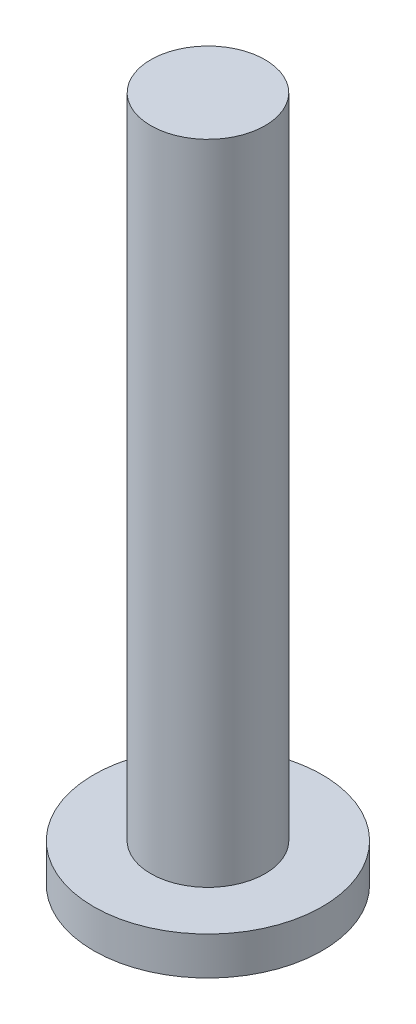
ISO-10303-21;
HEADER;
FILE_DESCRIPTION(('STEP AP214'),'2;1');
FILE_NAME('part.step','',(''),(''),'','','');
FILE_SCHEMA(('AUTOMOTIVE_DESIGN { 1 0 10303 214 1 1 1 1 }'));
ENDSEC;
DATA;
#1=APPLICATION_CONTEXT('core data for automotive mechanical design processes');
#2=APPLICATION_PROTOCOL_DEFINITION('international standard','automotive_design',2000,#1);
#3=PRODUCT_CONTEXT('',#1,'mechanical');
#4=PRODUCT('Part','Part','',(#3));
#5=PRODUCT_RELATED_PRODUCT_CATEGORY('part','',(#4));
#6=PRODUCT_DEFINITION_FORMATION('','',#4);
#7=PRODUCT_DEFINITION_CONTEXT('part definition',#1,'design');
#8=PRODUCT_DEFINITION('design','',#6,#7);
#9=PRODUCT_DEFINITION_SHAPE('','',#8);
#10=(LENGTH_UNIT() NAMED_UNIT(*) SI_UNIT(.MILLI.,.METRE.));
#11=(NAMED_UNIT(*) PLANE_ANGLE_UNIT() SI_UNIT($,.RADIAN.));
#12=(NAMED_UNIT(*) SI_UNIT($,.STERADIAN.) SOLID_ANGLE_UNIT());
#13=UNCERTAINTY_MEASURE_WITH_UNIT(LENGTH_MEASURE(1.E-05),#10,'distance_accuracy_value','');
#14=(GEOMETRIC_REPRESENTATION_CONTEXT(3) GLOBAL_UNCERTAINTY_ASSIGNED_CONTEXT((#13)) GLOBAL_UNIT_ASSIGNED_CONTEXT((#10,
#11,#12)) REPRESENTATION_CONTEXT('',''));
#15=CARTESIAN_POINT('',(0.,0.,0.));
#16=DIRECTION('',(0.,0.,1.));
#17=DIRECTION('',(1.,0.,0.));
#18=AXIS2_PLACEMENT_3D('',#15,#16,#17);
#19=CARTESIAN_POINT('',(0.,10.,0.));
#20=DIRECTION('',(0.,-1.,0.));
#21=DIRECTION('',(0.,0.,-1.));
#22=AXIS2_PLACEMENT_3D('',#19,#20,#21);
#23=CYLINDRICAL_SURFACE('',#22,30.);
#24=CARTESIAN_POINT('',(0.,10.,0.));
#25=DIRECTION('',(0.,1.,0.));
#26=DIRECTION('',(0.,0.,1.));
#27=AXIS2_PLACEMENT_3D('',#24,#25,#26);
#28=CIRCLE('',#27,30.);
#29=CARTESIAN_POINT('',(0.,10.,30.));
#30=VERTEX_POINT('',#29);
#31=EDGE_CURVE('E10',#30,#30,#28,.T.);
#32=ORIENTED_EDGE('',*,*,#31,.F.);
#33=EDGE_LOOP('',(#32));
#34=FACE_BOUND('',#33,.T.);
#35=CARTESIAN_POINT('',(0.,0.,0.));
#36=DIRECTION('',(0.,1.,0.));
#37=DIRECTION('',(0.,0.,1.));
#38=AXIS2_PLACEMENT_3D('',#35,#36,#37);
#39=CIRCLE('',#38,30.);
#40=CARTESIAN_POINT('',(0.,0.,30.));
#41=VERTEX_POINT('',#40);
#42=EDGE_CURVE('E34',#41,#41,#39,.T.);
#43=ORIENTED_EDGE('',*,*,#42,.T.);
#44=EDGE_LOOP('',(#43));
#45=FACE_BOUND('',#44,.T.);
#46=ADVANCED_FACE('F31',(#34,#45),#23,.T.);
#47=CARTESIAN_POINT('',(0.,10.,0.));
#48=DIRECTION('',(0.,1.,0.));
#49=DIRECTION('',(0.,0.,1.));
#50=AXIS2_PLACEMENT_3D('',#47,#48,#49);
#51=PLANE('',#50);
#52=CARTESIAN_POINT('',(0.,10.,0.));
#53=DIRECTION('',(0.,1.,0.));
#54=DIRECTION('',(0.,0.,1.));
#55=AXIS2_PLACEMENT_3D('',#52,#53,#54);
#56=CIRCLE('',#55,15.);
#57=CARTESIAN_POINT('',(0.,10.,15.));
#58=VERTEX_POINT('',#57);
#59=EDGE_CURVE('E43',#58,#58,#56,.T.);
#60=ORIENTED_EDGE('',*,*,#59,.F.);
#61=EDGE_LOOP('',(#60));
#62=FACE_BOUND('',#61,.T.);
#63=ORIENTED_EDGE('',*,*,#31,.T.);
#64=EDGE_LOOP('',(#63));
#65=FACE_BOUND('',#64,.T.);
#66=ADVANCED_FACE('F58',(#62,#65),#51,.T.);
#67=CARTESIAN_POINT('',(0.,0.,0.));
#68=DIRECTION('',(0.,1.,0.));
#69=DIRECTION('',(0.,0.,1.));
#70=AXIS2_PLACEMENT_3D('',#67,#68,#69);
#71=PLANE('',#70);
#72=ORIENTED_EDGE('',*,*,#42,.F.);
#73=EDGE_LOOP('',(#72));
#74=FACE_BOUND('',#73,.T.);
#75=ADVANCED_FACE('F54',(#74),#71,.F.);
#76=CARTESIAN_POINT('',(0.,180.,0.));
#77=DIRECTION('',(0.,-1.,0.));
#78=DIRECTION('',(0.,0.,-1.));
#79=AXIS2_PLACEMENT_3D('',#76,#77,#78);
#80=CYLINDRICAL_SURFACE('',#79,15.);
#81=CARTESIAN_POINT('',(0.,180.,0.));
#82=DIRECTION('',(0.,1.,0.));
#83=DIRECTION('',(0.,0.,1.));
#84=AXIS2_PLACEMENT_3D('',#81,#82,#83);
#85=CIRCLE('',#84,15.);
#86=CARTESIAN_POINT('',(0.,180.,15.));
#87=VERTEX_POINT('',#86);
#88=EDGE_CURVE('E41',#87,#87,#85,.T.);
#89=ORIENTED_EDGE('',*,*,#88,.F.);
#90=EDGE_LOOP('',(#89));
#91=FACE_BOUND('',#90,.T.);
#92=ORIENTED_EDGE('',*,*,#59,.T.);
#93=EDGE_LOOP('',(#92));
#94=FACE_BOUND('',#93,.T.);
#95=ADVANCED_FACE('F51',(#91,#94),#80,.T.);
#96=CARTESIAN_POINT('',(0.,180.,0.));
#97=DIRECTION('',(0.,1.,0.));
#98=DIRECTION('',(0.,0.,1.));
#99=AXIS2_PLACEMENT_3D('',#96,#97,#98);
#100=PLANE('',#99);
#101=ORIENTED_EDGE('',*,*,#88,.T.);
#102=EDGE_LOOP('',(#101));
#103=FACE_BOUND('',#102,.T.);
#104=ADVANCED_FACE('F49',(#103),#100,.T.);
#105=CLOSED_SHELL('',(#46,#66,#75,#95,#104));
#106=MANIFOLD_SOLID_BREP('B2',#105);
#107=ADVANCED_BREP_SHAPE_REPRESENTATION('',(#18,#106),#14);
#108=SHAPE_DEFINITION_REPRESENTATION(#9,#107);
ENDSEC;
END-ISO-10303-21;
